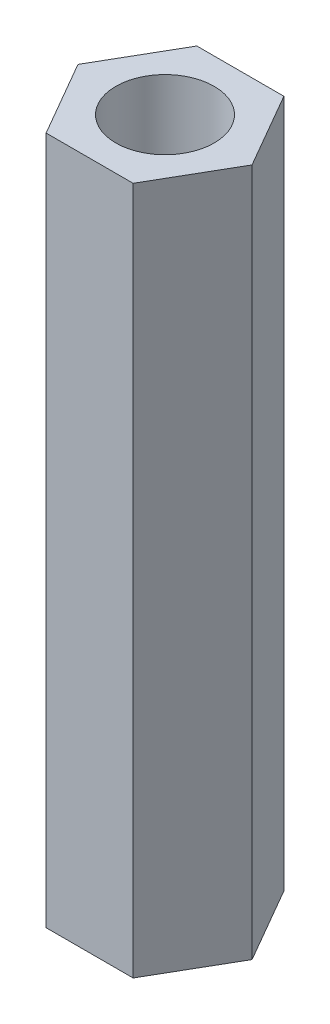
ISO-10303-21;
HEADER;
FILE_DESCRIPTION(('STEP AP214'),'2;1');
FILE_NAME('part.step','',(''),(''),'','','');
FILE_SCHEMA(('AUTOMOTIVE_DESIGN { 1 0 10303 214 1 1 1 1 }'));
ENDSEC;
DATA;
#1=APPLICATION_CONTEXT('core data for automotive mechanical design processes');
#2=APPLICATION_PROTOCOL_DEFINITION('international standard','automotive_design',2000,#1);
#3=PRODUCT_CONTEXT('',#1,'mechanical');
#4=PRODUCT('Part','Part','',(#3));
#5=PRODUCT_RELATED_PRODUCT_CATEGORY('part','',(#4));
#6=PRODUCT_DEFINITION_FORMATION('','',#4);
#7=PRODUCT_DEFINITION_CONTEXT('part definition',#1,'design');
#8=PRODUCT_DEFINITION('design','',#6,#7);
#9=PRODUCT_DEFINITION_SHAPE('','',#8);
#10=(LENGTH_UNIT() NAMED_UNIT(*) SI_UNIT(.MILLI.,.METRE.));
#11=(NAMED_UNIT(*) PLANE_ANGLE_UNIT() SI_UNIT($,.RADIAN.));
#12=(NAMED_UNIT(*) SI_UNIT($,.STERADIAN.) SOLID_ANGLE_UNIT());
#13=UNCERTAINTY_MEASURE_WITH_UNIT(LENGTH_MEASURE(1.E-05),#10,'distance_accuracy_value','');
#14=(GEOMETRIC_REPRESENTATION_CONTEXT(3) GLOBAL_UNCERTAINTY_ASSIGNED_CONTEXT((#13)) GLOBAL_UNIT_ASSIGNED_CONTEXT((#10,
#11,#12)) REPRESENTATION_CONTEXT('',''));
#15=CARTESIAN_POINT('',(0.,0.,0.));
#16=DIRECTION('',(0.,0.,1.));
#17=DIRECTION('',(1.,0.,0.));
#18=AXIS2_PLACEMENT_3D('',#15,#16,#17);
#19=CARTESIAN_POINT('',(1.32790561913614,21.,-2.3));
#20=DIRECTION('',(0.,0.,1.));
#21=DIRECTION('',(1.,0.,0.));
#22=AXIS2_PLACEMENT_3D('',#19,#20,#21);
#23=PLANE('',#22);
#24=DIRECTION('',(-1.,0.,0.));
#25=VECTOR('',#24,1.);
#26=CARTESIAN_POINT('',(1.32790561913614,0.,-2.3));
#27=LINE('',#26,#25);
#28=CARTESIAN_POINT('',(1.32790561913614,0.,-2.3));
#29=VERTEX_POINT('',#28);
#30=CARTESIAN_POINT('',(-1.32790561913614,0.,-2.3));
#31=VERTEX_POINT('',#30);
#32=EDGE_CURVE('E131',#29,#31,#27,.T.);
#33=ORIENTED_EDGE('',*,*,#32,.T.);
#34=DIRECTION('',(0.,-1.,0.));
#35=VECTOR('',#34,1.);
#36=CARTESIAN_POINT('',(-1.32790561913614,21.,-2.3));
#37=LINE('',#36,#35);
#38=CARTESIAN_POINT('',(-1.32790561913614,21.,-2.3));
#39=VERTEX_POINT('',#38);
#40=EDGE_CURVE('E11',#39,#31,#37,.T.);
#41=ORIENTED_EDGE('',*,*,#40,.F.);
#42=DIRECTION('',(-1.,0.,0.));
#43=VECTOR('',#42,1.);
#44=CARTESIAN_POINT('',(1.32790561913614,21.,-2.3));
#45=LINE('',#44,#43);
#46=CARTESIAN_POINT('',(1.32790561913614,21.,-2.3));
#47=VERTEX_POINT('',#46);
#48=EDGE_CURVE('E142',#47,#39,#45,.T.);
#49=ORIENTED_EDGE('',*,*,#48,.F.);
#50=DIRECTION('',(0.,-1.,0.));
#51=VECTOR('',#50,1.);
#52=CARTESIAN_POINT('',(1.32790561913614,21.,-2.3));
#53=LINE('',#52,#51);
#54=EDGE_CURVE('E127',#47,#29,#53,.T.);
#55=ORIENTED_EDGE('',*,*,#54,.T.);
#56=EDGE_LOOP('',(#33,#41,#49,#55));
#57=FACE_BOUND('',#56,.T.);
#58=ADVANCED_FACE('F47',(#57),#23,.F.);
#59=CARTESIAN_POINT('',(-1.32790561913614,21.,-2.3));
#60=DIRECTION('',(0.866025403784439,0.,0.5));
#61=DIRECTION('',(0.5,0.,-0.866025403784439));
#62=AXIS2_PLACEMENT_3D('',#59,#60,#61);
#63=PLANE('',#62);
#64=DIRECTION('',(-0.5,0.,0.866025403784439));
#65=VECTOR('',#64,1.);
#66=CARTESIAN_POINT('',(-1.32790561913614,0.,-2.3));
#67=LINE('',#66,#65);
#68=CARTESIAN_POINT('',(-2.65581123827228,0.,0.));
#69=VERTEX_POINT('',#68);
#70=EDGE_CURVE('E134',#31,#69,#67,.T.);
#71=ORIENTED_EDGE('',*,*,#70,.T.);
#72=DIRECTION('',(0.,-1.,0.));
#73=VECTOR('',#72,1.);
#74=CARTESIAN_POINT('',(-2.65581123827228,21.,0.));
#75=LINE('',#74,#73);
#76=CARTESIAN_POINT('',(-2.65581123827228,21.,0.));
#77=VERTEX_POINT('',#76);
#78=EDGE_CURVE('E55',#77,#69,#75,.T.);
#79=ORIENTED_EDGE('',*,*,#78,.F.);
#80=DIRECTION('',(-0.5,0.,0.866025403784439));
#81=VECTOR('',#80,1.);
#82=CARTESIAN_POINT('',(-1.32790561913614,21.,-2.3));
#83=LINE('',#82,#81);
#84=EDGE_CURVE('E100',#39,#77,#83,.T.);
#85=ORIENTED_EDGE('',*,*,#84,.F.);
#86=ORIENTED_EDGE('',*,*,#40,.T.);
#87=EDGE_LOOP('',(#71,#79,#85,#86));
#88=FACE_BOUND('',#87,.T.);
#89=ADVANCED_FACE('F167',(#88),#63,.F.);
#90=CARTESIAN_POINT('',(-2.65581123827228,21.,0.));
#91=DIRECTION('',(0.866025403784438,0.,-0.5));
#92=DIRECTION('',(-0.5,0.,-0.866025403784439));
#93=AXIS2_PLACEMENT_3D('',#90,#91,#92);
#94=PLANE('',#93);
#95=DIRECTION('',(0.5,0.,0.866025403784438));
#96=VECTOR('',#95,1.);
#97=CARTESIAN_POINT('',(-2.65581123827228,0.,0.));
#98=LINE('',#97,#96);
#99=CARTESIAN_POINT('',(-1.32790561913614,0.,2.3));
#100=VERTEX_POINT('',#99);
#101=EDGE_CURVE('E137',#69,#100,#98,.T.);
#102=ORIENTED_EDGE('',*,*,#101,.T.);
#103=DIRECTION('',(0.,-1.,0.));
#104=VECTOR('',#103,1.);
#105=CARTESIAN_POINT('',(-1.32790561913614,21.,2.3));
#106=LINE('',#105,#104);
#107=CARTESIAN_POINT('',(-1.32790561913614,21.,2.3));
#108=VERTEX_POINT('',#107);
#109=EDGE_CURVE('E122',#108,#100,#106,.T.);
#110=ORIENTED_EDGE('',*,*,#109,.F.);
#111=DIRECTION('',(0.5,0.,0.866025403784438));
#112=VECTOR('',#111,1.);
#113=CARTESIAN_POINT('',(-2.65581123827228,21.,0.));
#114=LINE('',#113,#112);
#115=EDGE_CURVE('E113',#77,#108,#114,.T.);
#116=ORIENTED_EDGE('',*,*,#115,.F.);
#117=ORIENTED_EDGE('',*,*,#78,.T.);
#118=EDGE_LOOP('',(#102,#110,#116,#117));
#119=FACE_BOUND('',#118,.T.);
#120=ADVANCED_FACE('F148',(#119),#94,.F.);
#121=CARTESIAN_POINT('',(-1.32790561913614,21.,2.3));
#122=DIRECTION('',(0.,0.,-1.));
#123=DIRECTION('',(-1.,0.,0.));
#124=AXIS2_PLACEMENT_3D('',#121,#122,#123);
#125=PLANE('',#124);
#126=DIRECTION('',(1.,0.,0.));
#127=VECTOR('',#126,1.);
#128=CARTESIAN_POINT('',(-1.32790561913614,0.,2.3));
#129=LINE('',#128,#127);
#130=CARTESIAN_POINT('',(1.32790561913614,0.,2.3));
#131=VERTEX_POINT('',#130);
#132=EDGE_CURVE('E121',#100,#131,#129,.T.);
#133=ORIENTED_EDGE('',*,*,#132,.T.);
#134=DIRECTION('',(0.,-1.,0.));
#135=VECTOR('',#134,1.);
#136=CARTESIAN_POINT('',(1.32790561913614,21.,2.3));
#137=LINE('',#136,#135);
#138=CARTESIAN_POINT('',(1.32790561913614,21.,2.3));
#139=VERTEX_POINT('',#138);
#140=EDGE_CURVE('E118',#139,#131,#137,.T.);
#141=ORIENTED_EDGE('',*,*,#140,.F.);
#142=DIRECTION('',(1.,0.,0.));
#143=VECTOR('',#142,1.);
#144=CARTESIAN_POINT('',(-1.32790561913614,21.,2.3));
#145=LINE('',#144,#143);
#146=EDGE_CURVE('E107',#108,#139,#145,.T.);
#147=ORIENTED_EDGE('',*,*,#146,.F.);
#148=ORIENTED_EDGE('',*,*,#109,.T.);
#149=EDGE_LOOP('',(#133,#141,#147,#148));
#150=FACE_BOUND('',#149,.T.);
#151=ADVANCED_FACE('F119',(#150),#125,.F.);
#152=CARTESIAN_POINT('',(1.32790561913614,21.,2.3));
#153=DIRECTION('',(-0.866025403784439,0.,-0.5));
#154=DIRECTION('',(-0.5,0.,0.866025403784439));
#155=AXIS2_PLACEMENT_3D('',#152,#153,#154);
#156=PLANE('',#155);
#157=DIRECTION('',(0.5,0.,-0.866025403784439));
#158=VECTOR('',#157,1.);
#159=CARTESIAN_POINT('',(1.32790561913614,0.,2.3));
#160=LINE('',#159,#158);
#161=CARTESIAN_POINT('',(2.65581123827228,0.,0.));
#162=VERTEX_POINT('',#161);
#163=EDGE_CURVE('E86',#131,#162,#160,.T.);
#164=ORIENTED_EDGE('',*,*,#163,.T.);
#165=DIRECTION('',(0.,-1.,0.));
#166=VECTOR('',#165,1.);
#167=CARTESIAN_POINT('',(2.65581123827228,21.,0.));
#168=LINE('',#167,#166);
#169=CARTESIAN_POINT('',(2.65581123827228,21.,0.));
#170=VERTEX_POINT('',#169);
#171=EDGE_CURVE('E123',#170,#162,#168,.T.);
#172=ORIENTED_EDGE('',*,*,#171,.F.);
#173=DIRECTION('',(0.5,0.,-0.866025403784439));
#174=VECTOR('',#173,1.);
#175=CARTESIAN_POINT('',(1.32790561913614,21.,2.3));
#176=LINE('',#175,#174);
#177=EDGE_CURVE('E111',#139,#170,#176,.T.);
#178=ORIENTED_EDGE('',*,*,#177,.F.);
#179=ORIENTED_EDGE('',*,*,#140,.T.);
#180=EDGE_LOOP('',(#164,#172,#178,#179));
#181=FACE_BOUND('',#180,.T.);
#182=ADVANCED_FACE('F125',(#181),#156,.F.);
#183=CARTESIAN_POINT('',(2.65581123827228,21.,0.));
#184=DIRECTION('',(-0.866025403784438,0.,0.5));
#185=DIRECTION('',(0.5,0.,0.866025403784439));
#186=AXIS2_PLACEMENT_3D('',#183,#184,#185);
#187=PLANE('',#186);
#188=DIRECTION('',(-0.5,0.,-0.866025403784438));
#189=VECTOR('',#188,1.);
#190=CARTESIAN_POINT('',(2.65581123827228,0.,0.));
#191=LINE('',#190,#189);
#192=EDGE_CURVE('E92',#162,#29,#191,.T.);
#193=ORIENTED_EDGE('',*,*,#192,.T.);
#194=ORIENTED_EDGE('',*,*,#54,.F.);
#195=DIRECTION('',(-0.5,0.,-0.866025403784438));
#196=VECTOR('',#195,1.);
#197=CARTESIAN_POINT('',(2.65581123827228,21.,0.));
#198=LINE('',#197,#196);
#199=EDGE_CURVE('E63',#170,#47,#198,.T.);
#200=ORIENTED_EDGE('',*,*,#199,.F.);
#201=ORIENTED_EDGE('',*,*,#171,.T.);
#202=EDGE_LOOP('',(#193,#194,#200,#201));
#203=FACE_BOUND('',#202,.T.);
#204=ADVANCED_FACE('F155',(#203),#187,.F.);
#205=CARTESIAN_POINT('',(0.,21.,0.));
#206=DIRECTION('',(0.,1.,0.));
#207=DIRECTION('',(0.,0.,1.));
#208=AXIS2_PLACEMENT_3D('',#205,#206,#207);
#209=PLANE('',#208);
#210=CARTESIAN_POINT('',(0.,21.,0.));
#211=DIRECTION('',(0.,1.,0.));
#212=DIRECTION('',(0.,0.,1.));
#213=AXIS2_PLACEMENT_3D('',#210,#211,#212);
#214=CIRCLE('',#213,1.5);
#215=CARTESIAN_POINT('',(0.,21.,1.5));
#216=VERTEX_POINT('',#215);
#217=EDGE_CURVE('E135',#216,#216,#214,.F.);
#218=ORIENTED_EDGE('',*,*,#217,.T.);
#219=EDGE_LOOP('',(#218));
#220=FACE_BOUND('',#219,.T.);
#221=ORIENTED_EDGE('',*,*,#48,.T.);
#222=ORIENTED_EDGE('',*,*,#84,.T.);
#223=ORIENTED_EDGE('',*,*,#115,.T.);
#224=ORIENTED_EDGE('',*,*,#146,.T.);
#225=ORIENTED_EDGE('',*,*,#177,.T.);
#226=ORIENTED_EDGE('',*,*,#199,.T.);
#227=EDGE_LOOP('',(#221,#222,#223,#224,#225,#226));
#228=FACE_BOUND('',#227,.T.);
#229=ADVANCED_FACE('F109',(#220,#228),#209,.T.);
#230=CARTESIAN_POINT('',(0.,0.,0.));
#231=DIRECTION('',(0.,1.,0.));
#232=DIRECTION('',(0.,0.,1.));
#233=AXIS2_PLACEMENT_3D('',#230,#231,#232);
#234=PLANE('',#233);
#235=CARTESIAN_POINT('',(0.,0.,0.));
#236=DIRECTION('',(0.,-1.,0.));
#237=DIRECTION('',(0.,0.,-1.));
#238=AXIS2_PLACEMENT_3D('',#235,#236,#237);
#239=CIRCLE('',#238,1.5);
#240=CARTESIAN_POINT('',(0.,0.,-1.5));
#241=VERTEX_POINT('',#240);
#242=EDGE_CURVE('E247',#241,#241,#239,.T.);
#243=ORIENTED_EDGE('',*,*,#242,.F.);
#244=EDGE_LOOP('',(#243));
#245=FACE_BOUND('',#244,.T.);
#246=ORIENTED_EDGE('',*,*,#32,.F.);
#247=ORIENTED_EDGE('',*,*,#192,.F.);
#248=ORIENTED_EDGE('',*,*,#163,.F.);
#249=ORIENTED_EDGE('',*,*,#132,.F.);
#250=ORIENTED_EDGE('',*,*,#101,.F.);
#251=ORIENTED_EDGE('',*,*,#70,.F.);
#252=EDGE_LOOP('',(#246,#247,#248,#249,#250,#251));
#253=FACE_BOUND('',#252,.T.);
#254=ADVANCED_FACE('F151',(#245,#253),#234,.F.);
#255=CARTESIAN_POINT('',(0.,25.2426406871193,0.));
#256=DIRECTION('',(0.,-1.,0.));
#257=DIRECTION('',(0.,0.,-1.));
#258=AXIS2_PLACEMENT_3D('',#255,#256,#257);
#259=CYLINDRICAL_SURFACE('',#258,1.5);
#260=ORIENTED_EDGE('',*,*,#242,.T.);
#261=EDGE_LOOP('',(#260));
#262=FACE_BOUND('',#261,.T.);
#263=ORIENTED_EDGE('',*,*,#217,.F.);
#264=EDGE_LOOP('',(#263));
#265=FACE_BOUND('',#264,.T.);
#266=ADVANCED_FACE('F207',(#262,#265),#259,.F.);
#267=CLOSED_SHELL('',(#58,#89,#120,#151,#182,#204,#229,#254,#266));
#268=MANIFOLD_SOLID_BREP('B2',#267);
#269=ADVANCED_BREP_SHAPE_REPRESENTATION('',(#18,#268),#14);
#270=SHAPE_DEFINITION_REPRESENTATION(#9,#269);
ENDSEC;
END-ISO-10303-21;
